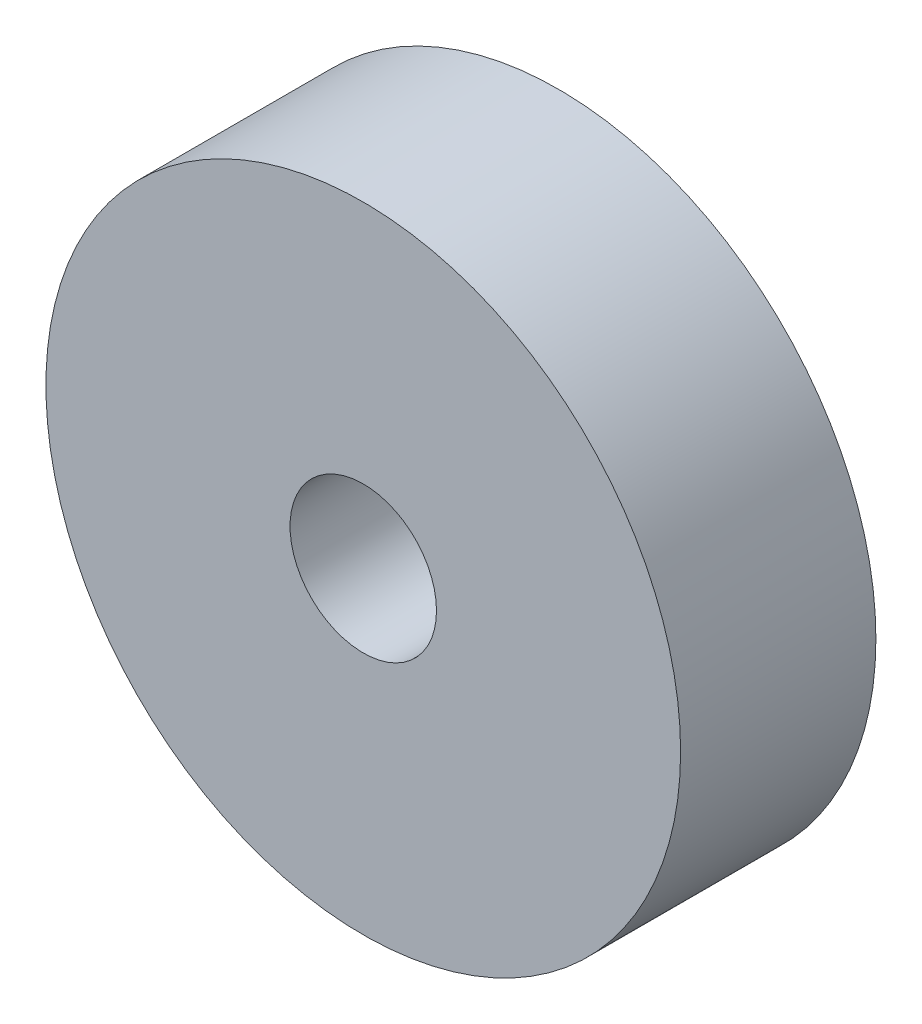
ISO-10303-21;
HEADER;
FILE_DESCRIPTION(('STEP AP214'),'2;1');
FILE_NAME('part.step','',(''),(''),'','','');
FILE_SCHEMA(('AUTOMOTIVE_DESIGN { 1 0 10303 214 1 1 1 1 }'));
ENDSEC;
DATA;
#1=APPLICATION_CONTEXT('core data for automotive mechanical design processes');
#2=APPLICATION_PROTOCOL_DEFINITION('international standard','automotive_design',2000,#1);
#3=PRODUCT_CONTEXT('',#1,'mechanical');
#4=PRODUCT('Part','Part','',(#3));
#5=PRODUCT_RELATED_PRODUCT_CATEGORY('part','',(#4));
#6=PRODUCT_DEFINITION_FORMATION('','',#4);
#7=PRODUCT_DEFINITION_CONTEXT('part definition',#1,'design');
#8=PRODUCT_DEFINITION('design','',#6,#7);
#9=PRODUCT_DEFINITION_SHAPE('','',#8);
#10=(LENGTH_UNIT() NAMED_UNIT(*) SI_UNIT(.MILLI.,.METRE.));
#11=(NAMED_UNIT(*) PLANE_ANGLE_UNIT() SI_UNIT($,.RADIAN.));
#12=(NAMED_UNIT(*) SI_UNIT($,.STERADIAN.) SOLID_ANGLE_UNIT());
#13=UNCERTAINTY_MEASURE_WITH_UNIT(LENGTH_MEASURE(1.E-05),#10,'distance_accuracy_value','');
#14=(GEOMETRIC_REPRESENTATION_CONTEXT(3) GLOBAL_UNCERTAINTY_ASSIGNED_CONTEXT((#13)) GLOBAL_UNIT_ASSIGNED_CONTEXT((#10,
#11,#12)) REPRESENTATION_CONTEXT('',''));
#15=CARTESIAN_POINT('',(0.,0.,0.));
#16=DIRECTION('',(0.,0.,1.));
#17=DIRECTION('',(1.,0.,0.));
#18=AXIS2_PLACEMENT_3D('',#15,#16,#17);
#19=CARTESIAN_POINT('',(0.,0.,2.));
#20=DIRECTION('',(0.,0.,1.));
#21=DIRECTION('',(1.,0.,0.));
#22=AXIS2_PLACEMENT_3D('',#19,#20,#21);
#23=PLANE('',#22);
#24=CARTESIAN_POINT('',(0.,0.,2.));
#25=DIRECTION('',(0.,0.,1.));
#26=DIRECTION('',(1.,0.,0.));
#27=AXIS2_PLACEMENT_3D('',#24,#25,#26);
#28=CIRCLE('',#27,3.25);
#29=CARTESIAN_POINT('',(3.25,0.,2.));
#30=VERTEX_POINT('',#29);
#31=EDGE_CURVE('E11',#30,#30,#28,.T.);
#32=ORIENTED_EDGE('',*,*,#31,.T.);
#33=EDGE_LOOP('',(#32));
#34=FACE_BOUND('',#33,.T.);
#35=CARTESIAN_POINT('',(0.,0.,2.));
#36=DIRECTION('',(0.,0.,1.));
#37=DIRECTION('',(1.,0.,0.));
#38=AXIS2_PLACEMENT_3D('',#35,#36,#37);
#39=CIRCLE('',#38,0.75);
#40=CARTESIAN_POINT('',(0.75,0.,2.));
#41=VERTEX_POINT('',#40);
#42=EDGE_CURVE('E57',#41,#41,#39,.T.);
#43=ORIENTED_EDGE('',*,*,#42,.F.);
#44=EDGE_LOOP('',(#43));
#45=FACE_BOUND('',#44,.T.);
#46=ADVANCED_FACE('F44',(#34,#45),#23,.T.);
#47=CARTESIAN_POINT('',(0.,0.,0.));
#48=DIRECTION('',(0.,0.,1.));
#49=DIRECTION('',(1.,0.,0.));
#50=AXIS2_PLACEMENT_3D('',#47,#48,#49);
#51=PLANE('',#50);
#52=CARTESIAN_POINT('',(0.,0.,0.));
#53=DIRECTION('',(0.,0.,1.));
#54=DIRECTION('',(1.,0.,0.));
#55=AXIS2_PLACEMENT_3D('',#52,#53,#54);
#56=CIRCLE('',#55,3.25);
#57=CARTESIAN_POINT('',(3.25,0.,0.));
#58=VERTEX_POINT('',#57);
#59=EDGE_CURVE('E47',#58,#58,#56,.T.);
#60=ORIENTED_EDGE('',*,*,#59,.F.);
#61=EDGE_LOOP('',(#60));
#62=FACE_BOUND('',#61,.T.);
#63=CARTESIAN_POINT('',(0.,0.,0.));
#64=DIRECTION('',(0.,0.,1.));
#65=DIRECTION('',(1.,0.,0.));
#66=AXIS2_PLACEMENT_3D('',#63,#64,#65);
#67=CIRCLE('',#66,0.75);
#68=CARTESIAN_POINT('',(0.75,0.,0.));
#69=VERTEX_POINT('',#68);
#70=EDGE_CURVE('E59',#69,#69,#67,.T.);
#71=ORIENTED_EDGE('',*,*,#70,.T.);
#72=EDGE_LOOP('',(#71));
#73=FACE_BOUND('',#72,.T.);
#74=ADVANCED_FACE('F66',(#62,#73),#51,.F.);
#75=CARTESIAN_POINT('',(0.,0.,2.));
#76=DIRECTION('',(0.,0.,-1.));
#77=DIRECTION('',(-1.,0.,0.));
#78=AXIS2_PLACEMENT_3D('',#75,#76,#77);
#79=CYLINDRICAL_SURFACE('',#78,3.25);
#80=ORIENTED_EDGE('',*,*,#31,.F.);
#81=EDGE_LOOP('',(#80));
#82=FACE_BOUND('',#81,.T.);
#83=ORIENTED_EDGE('',*,*,#59,.T.);
#84=EDGE_LOOP('',(#83));
#85=FACE_BOUND('',#84,.T.);
#86=ADVANCED_FACE('F50',(#82,#85),#79,.T.);
#87=CARTESIAN_POINT('',(0.,0.,2.));
#88=DIRECTION('',(0.,0.,-1.));
#89=DIRECTION('',(-1.,0.,0.));
#90=AXIS2_PLACEMENT_3D('',#87,#88,#89);
#91=CYLINDRICAL_SURFACE('',#90,0.75);
#92=ORIENTED_EDGE('',*,*,#42,.T.);
#93=EDGE_LOOP('',(#92));
#94=FACE_BOUND('',#93,.T.);
#95=ORIENTED_EDGE('',*,*,#70,.F.);
#96=EDGE_LOOP('',(#95));
#97=FACE_BOUND('',#96,.T.);
#98=ADVANCED_FACE('F63',(#94,#97),#91,.F.);
#99=CLOSED_SHELL('',(#46,#74,#86,#98));
#100=MANIFOLD_SOLID_BREP('B2',#99);
#101=ADVANCED_BREP_SHAPE_REPRESENTATION('',(#18,#100),#14);
#102=SHAPE_DEFINITION_REPRESENTATION(#9,#101);
ENDSEC;
END-ISO-10303-21;
